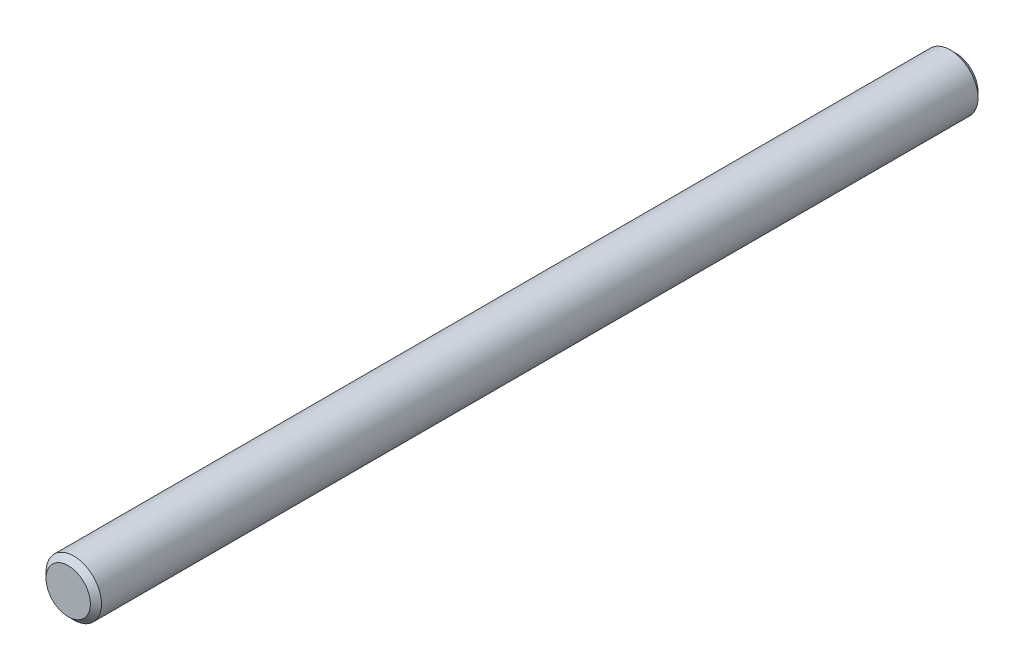
ISO-10303-21;
HEADER;
FILE_DESCRIPTION(('STEP AP214'),'2;1');
FILE_NAME('part.step','',(''),(''),'','','');
FILE_SCHEMA(('AUTOMOTIVE_DESIGN { 1 0 10303 214 1 1 1 1 }'));
ENDSEC;
DATA;
#1=APPLICATION_CONTEXT('core data for automotive mechanical design processes');
#2=APPLICATION_PROTOCOL_DEFINITION('international standard','automotive_design',2000,#1);
#3=PRODUCT_CONTEXT('',#1,'mechanical');
#4=PRODUCT('Part','Part','',(#3));
#5=PRODUCT_RELATED_PRODUCT_CATEGORY('part','',(#4));
#6=PRODUCT_DEFINITION_FORMATION('','',#4);
#7=PRODUCT_DEFINITION_CONTEXT('part definition',#1,'design');
#8=PRODUCT_DEFINITION('design','',#6,#7);
#9=PRODUCT_DEFINITION_SHAPE('','',#8);
#10=(LENGTH_UNIT() NAMED_UNIT(*) SI_UNIT(.MILLI.,.METRE.));
#11=(NAMED_UNIT(*) PLANE_ANGLE_UNIT() SI_UNIT($,.RADIAN.));
#12=(NAMED_UNIT(*) SI_UNIT($,.STERADIAN.) SOLID_ANGLE_UNIT());
#13=UNCERTAINTY_MEASURE_WITH_UNIT(LENGTH_MEASURE(1.E-05),#10,'distance_accuracy_value','');
#14=(GEOMETRIC_REPRESENTATION_CONTEXT(3) GLOBAL_UNCERTAINTY_ASSIGNED_CONTEXT((#13)) GLOBAL_UNIT_ASSIGNED_CONTEXT((#10,
#11,#12)) REPRESENTATION_CONTEXT('',''));
#15=CARTESIAN_POINT('',(0.,0.,0.));
#16=DIRECTION('',(0.,0.,1.));
#17=DIRECTION('',(1.,0.,0.));
#18=AXIS2_PLACEMENT_3D('',#15,#16,#17);
#19=CARTESIAN_POINT('',(0.,0.,50.8));
#20=DIRECTION('',(0.,0.,-1.));
#21=DIRECTION('',(-1.,0.,0.));
#22=AXIS2_PLACEMENT_3D('',#19,#20,#21);
#23=CYLINDRICAL_SURFACE('',#22,3.175);
#24=CARTESIAN_POINT('',(0.,0.,-50.165));
#25=DIRECTION('',(0.,0.,1.));
#26=DIRECTION('',(1.,0.,0.));
#27=AXIS2_PLACEMENT_3D('',#24,#25,#26);
#28=CIRCLE('',#27,3.175);
#29=CARTESIAN_POINT('',(3.175,0.,-50.165));
#30=VERTEX_POINT('',#29);
#31=EDGE_CURVE('E50',#30,#30,#28,.T.);
#32=ORIENTED_EDGE('',*,*,#31,.T.);
#33=EDGE_LOOP('',(#32));
#34=FACE_BOUND('',#33,.T.);
#35=CARTESIAN_POINT('',(0.,0.,50.165));
#36=DIRECTION('',(0.,0.,1.));
#37=DIRECTION('',(1.,0.,0.));
#38=AXIS2_PLACEMENT_3D('',#35,#36,#37);
#39=CIRCLE('',#38,3.175);
#40=CARTESIAN_POINT('',(3.175,0.,50.165));
#41=VERTEX_POINT('',#40);
#42=EDGE_CURVE('E55',#41,#41,#39,.F.);
#43=ORIENTED_EDGE('',*,*,#42,.T.);
#44=EDGE_LOOP('',(#43));
#45=FACE_BOUND('',#44,.T.);
#46=ADVANCED_FACE('F37',(#34,#45),#23,.T.);
#47=CARTESIAN_POINT('',(0.,0.,50.8));
#48=DIRECTION('',(0.,0.,1.));
#49=DIRECTION('',(1.,0.,0.));
#50=AXIS2_PLACEMENT_3D('',#47,#48,#49);
#51=PLANE('',#50);
#52=CARTESIAN_POINT('',(0.,0.,50.8));
#53=DIRECTION('',(0.,0.,1.));
#54=DIRECTION('',(1.,0.,0.));
#55=AXIS2_PLACEMENT_3D('',#52,#53,#54);
#56=CIRCLE('',#55,2.54);
#57=CARTESIAN_POINT('',(2.54,0.,50.8));
#58=VERTEX_POINT('',#57);
#59=EDGE_CURVE('E10',#58,#58,#56,.T.);
#60=ORIENTED_EDGE('',*,*,#59,.T.);
#61=EDGE_LOOP('',(#60));
#62=FACE_BOUND('',#61,.T.);
#63=ADVANCED_FACE('F72',(#62),#51,.T.);
#64=CARTESIAN_POINT('',(0.,0.,-50.8));
#65=DIRECTION('',(0.,0.,1.));
#66=DIRECTION('',(1.,0.,0.));
#67=AXIS2_PLACEMENT_3D('',#64,#65,#66);
#68=PLANE('',#67);
#69=CARTESIAN_POINT('',(0.,0.,-50.8));
#70=DIRECTION('',(0.,0.,1.));
#71=DIRECTION('',(1.,0.,0.));
#72=AXIS2_PLACEMENT_3D('',#69,#70,#71);
#73=CIRCLE('',#72,2.54000000000001);
#74=CARTESIAN_POINT('',(2.54000000000001,0.,-50.8));
#75=VERTEX_POINT('',#74);
#76=EDGE_CURVE('E45',#75,#75,#73,.F.);
#77=ORIENTED_EDGE('',*,*,#76,.T.);
#78=EDGE_LOOP('',(#77));
#79=FACE_BOUND('',#78,.T.);
#80=ADVANCED_FACE('F69',(#79),#68,.F.);
#81=CARTESIAN_POINT('',(0.,0.,-50.165));
#82=DIRECTION('',(0.,0.,1.));
#83=DIRECTION('',(1.,0.,0.));
#84=AXIS2_PLACEMENT_3D('',#81,#82,#83);
#85=CONICAL_SURFACE('',#84,3.175,0.785398163397451);
#86=CARTESIAN_POINT('',(2.54000000000001,0.,-50.8));
#87=CARTESIAN_POINT('',(2.54661458333334,0.,-50.7933854166667));
#88=CARTESIAN_POINT('',(2.55322916666668,0.,-50.7867708333333));
#89=CARTESIAN_POINT('',(2.56645833333334,0.,-50.7735416666667));
#90=CARTESIAN_POINT('',(2.57307291666668,0.,-50.7669270833333));
#91=CARTESIAN_POINT('',(2.58630208333334,0.,-50.7536979166667));
#92=CARTESIAN_POINT('',(2.59291666666668,0.,-50.7470833333333));
#93=CARTESIAN_POINT('',(2.60614583333334,0.,-50.7338541666667));
#94=CARTESIAN_POINT('',(2.61276041666668,0.,-50.7272395833333));
#95=CARTESIAN_POINT('',(2.62598958333334,0.,-50.7140104166667));
#96=CARTESIAN_POINT('',(2.63260416666668,0.,-50.7073958333333));
#97=CARTESIAN_POINT('',(2.64583333333334,0.,-50.6941666666667));
#98=CARTESIAN_POINT('',(2.65244791666668,0.,-50.6875520833333));
#99=CARTESIAN_POINT('',(2.66567708333334,0.,-50.6743229166667));
#100=CARTESIAN_POINT('',(2.67229166666667,0.,-50.6677083333333));
#101=CARTESIAN_POINT('',(2.68552083333334,0.,-50.6544791666667));
#102=CARTESIAN_POINT('',(2.69213541666667,0.,-50.6478645833333));
#103=CARTESIAN_POINT('',(2.70536458333334,0.,-50.6346354166667));
#104=CARTESIAN_POINT('',(2.71197916666667,0.,-50.6280208333333));
#105=CARTESIAN_POINT('',(2.72520833333334,0.,-50.6147916666667));
#106=CARTESIAN_POINT('',(2.73182291666667,0.,-50.6081770833333));
#107=CARTESIAN_POINT('',(2.74505208333334,0.,-50.5949479166667));
#108=CARTESIAN_POINT('',(2.75166666666667,0.,-50.5883333333333));
#109=CARTESIAN_POINT('',(2.76489583333334,0.,-50.5751041666667));
#110=CARTESIAN_POINT('',(2.77151041666667,0.,-50.5684895833333));
#111=CARTESIAN_POINT('',(2.78473958333334,0.,-50.5552604166667));
#112=CARTESIAN_POINT('',(2.79135416666667,0.,-50.5486458333333));
#113=CARTESIAN_POINT('',(2.80458333333334,0.,-50.5354166666667));
#114=CARTESIAN_POINT('',(2.81119791666667,0.,-50.5288020833333));
#115=CARTESIAN_POINT('',(2.82442708333334,0.,-50.5155729166667));
#116=CARTESIAN_POINT('',(2.83104166666667,0.,-50.5089583333333));
#117=CARTESIAN_POINT('',(2.84427083333334,0.,-50.4957291666667));
#118=CARTESIAN_POINT('',(2.85088541666667,0.,-50.4891145833333));
#119=CARTESIAN_POINT('',(2.86411458333334,0.,-50.4758854166667));
#120=CARTESIAN_POINT('',(2.87072916666667,0.,-50.4692708333333));
#121=CARTESIAN_POINT('',(2.88395833333334,0.,-50.4560416666667));
#122=CARTESIAN_POINT('',(2.89057291666667,0.,-50.4494270833333));
#123=CARTESIAN_POINT('',(2.90380208333334,0.,-50.4361979166667));
#124=CARTESIAN_POINT('',(2.91041666666667,0.,-50.4295833333333));
#125=CARTESIAN_POINT('',(2.92364583333334,0.,-50.4163541666667));
#126=CARTESIAN_POINT('',(2.93026041666667,0.,-50.4097395833333));
#127=CARTESIAN_POINT('',(2.94348958333334,0.,-50.3965104166667));
#128=CARTESIAN_POINT('',(2.95010416666667,0.,-50.3898958333333));
#129=CARTESIAN_POINT('',(2.96333333333334,0.,-50.3766666666667));
#130=CARTESIAN_POINT('',(2.96994791666667,0.,-50.3700520833333));
#131=CARTESIAN_POINT('',(2.98317708333333,0.,-50.3568229166667));
#132=CARTESIAN_POINT('',(2.98979166666667,0.,-50.3502083333333));
#133=CARTESIAN_POINT('',(3.00302083333334,0.,-50.3369791666667));
#134=CARTESIAN_POINT('',(3.00963541666667,0.,-50.3303645833333));
#135=CARTESIAN_POINT('',(3.02286458333333,0.,-50.3171354166667));
#136=CARTESIAN_POINT('',(3.02947916666667,0.,-50.3105208333333));
#137=CARTESIAN_POINT('',(3.04270833333333,0.,-50.2972916666667));
#138=CARTESIAN_POINT('',(3.04932291666667,0.,-50.2906770833333));
#139=CARTESIAN_POINT('',(3.06255208333333,0.,-50.2774479166667));
#140=CARTESIAN_POINT('',(3.06916666666667,0.,-50.2708333333333));
#141=CARTESIAN_POINT('',(3.08239583333333,0.,-50.2576041666667));
#142=CARTESIAN_POINT('',(3.08901041666667,0.,-50.2509895833334));
#143=CARTESIAN_POINT('',(3.10223958333333,0.,-50.2377604166667));
#144=CARTESIAN_POINT('',(3.10885416666667,0.,-50.2311458333334));
#145=CARTESIAN_POINT('',(3.12208333333333,0.,-50.2179166666667));
#146=CARTESIAN_POINT('',(3.12869791666667,0.,-50.2113020833334));
#147=CARTESIAN_POINT('',(3.14192708333333,0.,-50.1980729166667));
#148=CARTESIAN_POINT('',(3.14854166666667,0.,-50.1914583333334));
#149=CARTESIAN_POINT('',(3.16177083333333,0.,-50.1782291666667));
#150=CARTESIAN_POINT('',(3.16838541666667,0.,-50.1716145833334));
#151=CARTESIAN_POINT('',(3.175,0.,-50.165));
#152=B_SPLINE_CURVE_WITH_KNOTS('',3,(#86,#87,#88,#89,#90,#91,#92,#93,#94,#95,#96,#97,#98,#99,
#100,#101,#102,#103,#104,#105,#106,#107,#108,#109,#110,#111,#112,#113,#114,#115,#116,#117,#118,
#119,#120,#121,#122,#123,#124,#125,#126,#127,#128,#129,#130,#131,#132,#133,#134,#135,#136,#137,
#138,#139,#140,#141,#142,#143,#144,#145,#146,#147,#148,#149,#150,#151),.UNSPECIFIED.,.F.,.F.,(4,
2,2,2,2,2,2,2,2,2,2,2,2,2,2,2,2,2,2,2,2,2,2,2,2,2,2,2,2,2,2,2,4),(0.,0.0280633003783446,
0.0561266007566841,0.0841899011350235,0.112253201513363,0.140316501891703,0.168379802270047,
0.196443102648386,0.224506403026726,0.252569703405066,0.280633003783405,0.308696304161749,
0.336759604540089,0.364822904918428,0.392886205296768,0.420949505675107,0.449012806053447,
0.477076106431791,0.505139406810131,0.53320270718847,0.56126600756681,0.589329307945149,
0.617392608323494,0.645455908701833,0.673519209080173,0.701582509458512,0.729645809836852,
0.757709110215196,0.785772410593536,0.813835710971875,0.841899011350215,0.869962311728555,
0.898025612106899),.UNSPECIFIED.);
#153=EDGE_CURVE('BSEAM65',#75,#30,#152,.T.);
#154=ORIENTED_EDGE('',*,*,#76,.F.);
#155=ORIENTED_EDGE('',*,*,#31,.F.);
#156=ORIENTED_EDGE('',*,*,#153,.T.);
#157=ORIENTED_EDGE('',*,*,#153,.F.);
#158=EDGE_LOOP('',(#154,#156,#155,#157));
#159=FACE_BOUND('',#158,.T.);
#160=ADVANCED_FACE('F65',(#159),#85,.T.);
#161=CARTESIAN_POINT('',(0.,0.,50.8));
#162=DIRECTION('',(0.,0.,-1.));
#163=DIRECTION('',(-1.,0.,0.));
#164=AXIS2_PLACEMENT_3D('',#161,#162,#163);
#165=CONICAL_SURFACE('',#164,2.54,0.785398163397451);
#166=ORIENTED_EDGE('',*,*,#42,.F.);
#167=EDGE_LOOP('',(#166));
#168=FACE_BOUND('',#167,.T.);
#169=ORIENTED_EDGE('',*,*,#59,.F.);
#170=EDGE_LOOP('',(#169));
#171=FACE_BOUND('',#170,.T.);
#172=ADVANCED_FACE('F39',(#168,#171),#165,.T.);
#173=CLOSED_SHELL('',(#46,#63,#80,#160,#172));
#174=MANIFOLD_SOLID_BREP('B2',#173);
#175=ADVANCED_BREP_SHAPE_REPRESENTATION('',(#18,#174),#14);
#176=SHAPE_DEFINITION_REPRESENTATION(#9,#175);
ENDSEC;
END-ISO-10303-21;
